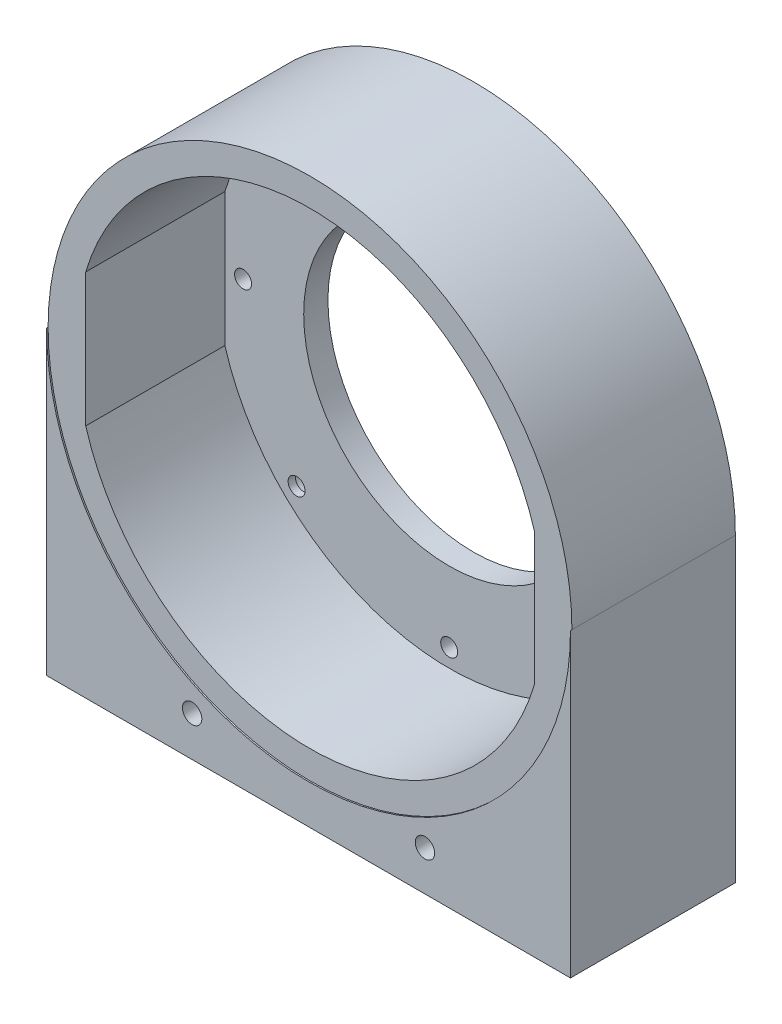
ISO-10303-21;
HEADER;
FILE_DESCRIPTION(('STEP AP214'),'2;1');
FILE_NAME('part.step','',(''),(''),'','','');
FILE_SCHEMA(('AUTOMOTIVE_DESIGN { 1 0 10303 214 1 1 1 1 }'));
ENDSEC;
DATA;
#1=APPLICATION_CONTEXT('core data for automotive mechanical design processes');
#2=APPLICATION_PROTOCOL_DEFINITION('international standard','automotive_design',2000,#1);
#3=PRODUCT_CONTEXT('',#1,'mechanical');
#4=PRODUCT('Part','Part','',(#3));
#5=PRODUCT_RELATED_PRODUCT_CATEGORY('part','',(#4));
#6=PRODUCT_DEFINITION_FORMATION('','',#4);
#7=PRODUCT_DEFINITION_CONTEXT('part definition',#1,'design');
#8=PRODUCT_DEFINITION('design','',#6,#7);
#9=PRODUCT_DEFINITION_SHAPE('','',#8);
#10=(LENGTH_UNIT() NAMED_UNIT(*) SI_UNIT(.MILLI.,.METRE.));
#11=(NAMED_UNIT(*) PLANE_ANGLE_UNIT() SI_UNIT($,.RADIAN.));
#12=(NAMED_UNIT(*) SI_UNIT($,.STERADIAN.) SOLID_ANGLE_UNIT());
#13=UNCERTAINTY_MEASURE_WITH_UNIT(LENGTH_MEASURE(1.E-05),#10,'distance_accuracy_value','');
#14=(GEOMETRIC_REPRESENTATION_CONTEXT(3) GLOBAL_UNCERTAINTY_ASSIGNED_CONTEXT((#13)) GLOBAL_UNIT_ASSIGNED_CONTEXT((#10,
#11,#12)) REPRESENTATION_CONTEXT('',''));
#15=CARTESIAN_POINT('',(0.,0.,0.));
#16=DIRECTION('',(0.,0.,1.));
#17=DIRECTION('',(1.,0.,0.));
#18=AXIS2_PLACEMENT_3D('',#15,#16,#17);
#19=CARTESIAN_POINT('',(0.,0.,28.7));
#20=DIRECTION('',(0.,0.,-1.));
#21=DIRECTION('',(-1.,0.,0.));
#22=AXIS2_PLACEMENT_3D('',#19,#20,#21);
#23=CYLINDRICAL_SURFACE('',#22,54.);
#24=CARTESIAN_POINT('',(0.,0.,-5.));
#25=DIRECTION('',(0.,0.,-1.));
#26=DIRECTION('',(-1.,0.,0.));
#27=AXIS2_PLACEMENT_3D('',#24,#25,#26);
#28=CIRCLE('',#27,54.);
#29=CARTESIAN_POINT('',(-54.,0.,-5.));
#30=VERTEX_POINT('',#29);
#31=CARTESIAN_POINT('',(54.,0.,-5.));
#32=VERTEX_POINT('',#31);
#33=EDGE_CURVE('E42',#30,#32,#28,.T.);
#34=ORIENTED_EDGE('',*,*,#33,.F.);
#35=DIRECTION('',(0.,0.,-1.));
#36=VECTOR('',#35,1.);
#37=CARTESIAN_POINT('',(-54.,0.,29.));
#38=LINE('',#37,#36);
#39=CARTESIAN_POINT('',(-54.,0.,28.7));
#40=VERTEX_POINT('',#39);
#41=EDGE_CURVE('E162',#40,#30,#38,.T.);
#42=ORIENTED_EDGE('',*,*,#41,.F.);
#43=CARTESIAN_POINT('',(0.,0.,28.7));
#44=DIRECTION('',(0.,0.,-1.));
#45=DIRECTION('',(-1.,0.,0.));
#46=AXIS2_PLACEMENT_3D('',#43,#44,#45);
#47=CIRCLE('',#46,54.);
#48=CARTESIAN_POINT('',(54.,0.,28.7));
#49=VERTEX_POINT('',#48);
#50=EDGE_CURVE('E11',#40,#49,#47,.T.);
#51=ORIENTED_EDGE('',*,*,#50,.T.);
#52=DIRECTION('',(0.,0.,-1.));
#53=VECTOR('',#52,1.);
#54=CARTESIAN_POINT('',(54.,0.,29.));
#55=LINE('',#54,#53);
#56=EDGE_CURVE('E158',#49,#32,#55,.T.);
#57=ORIENTED_EDGE('',*,*,#56,.T.);
#58=EDGE_LOOP('',(#34,#42,#51,#57));
#59=FACE_BOUND('',#58,.T.);
#60=ADVANCED_FACE('F39',(#59),#23,.T.);
#61=CARTESIAN_POINT('',(0.,0.,28.7));
#62=DIRECTION('',(0.,0.,-1.));
#63=DIRECTION('',(-1.,0.,0.));
#64=AXIS2_PLACEMENT_3D('',#61,#62,#63);
#65=PLANE('',#64);
#66=DIRECTION('',(0.,1.,0.));
#67=VECTOR('',#66,1.);
#68=CARTESIAN_POINT('',(-46.25,13.7477270848675,28.7));
#69=LINE('',#68,#67);
#70=CARTESIAN_POINT('',(-46.25,-13.7477270848675,28.7));
#71=VERTEX_POINT('',#70);
#72=CARTESIAN_POINT('',(-46.25,13.7477270848675,28.7));
#73=VERTEX_POINT('',#72);
#74=EDGE_CURVE('E134',#71,#73,#69,.T.);
#75=ORIENTED_EDGE('',*,*,#74,.T.);
#76=CARTESIAN_POINT('',(0.,0.,28.7));
#77=DIRECTION('',(0.,0.,-1.));
#78=DIRECTION('',(1.,0.,0.));
#79=AXIS2_PLACEMENT_3D('',#76,#77,#78);
#80=CIRCLE('',#79,48.25);
#81=CARTESIAN_POINT('',(46.25,13.7477270848676,28.7));
#82=VERTEX_POINT('',#81);
#83=EDGE_CURVE('E128',#73,#82,#80,.T.);
#84=ORIENTED_EDGE('',*,*,#83,.T.);
#85=DIRECTION('',(0.,-1.,0.));
#86=VECTOR('',#85,1.);
#87=CARTESIAN_POINT('',(46.25,13.7477270848676,28.7));
#88=LINE('',#87,#86);
#89=CARTESIAN_POINT('',(46.25,-13.7477270848676,28.7));
#90=VERTEX_POINT('',#89);
#91=EDGE_CURVE('E145',#82,#90,#88,.T.);
#92=ORIENTED_EDGE('',*,*,#91,.T.);
#93=CARTESIAN_POINT('',(0.,0.,28.7));
#94=DIRECTION('',(0.,0.,-1.));
#95=DIRECTION('',(-1.,0.,0.));
#96=AXIS2_PLACEMENT_3D('',#93,#94,#95);
#97=CIRCLE('',#96,48.25);
#98=EDGE_CURVE('E142',#90,#71,#97,.T.);
#99=ORIENTED_EDGE('',*,*,#98,.T.);
#100=EDGE_LOOP('',(#75,#84,#92,#99));
#101=FACE_BOUND('',#100,.T.);
#102=ORIENTED_EDGE('',*,*,#50,.F.);
#103=CARTESIAN_POINT('',(0.,0.,28.7));
#104=DIRECTION('',(0.,0.,-1.));
#105=DIRECTION('',(-1.,0.,0.));
#106=AXIS2_PLACEMENT_3D('',#103,#104,#105);
#107=CIRCLE('',#106,54.);
#108=EDGE_CURVE('E150',#40,#49,#107,.F.);
#109=ORIENTED_EDGE('',*,*,#108,.T.);
#110=EDGE_LOOP('',(#102,#109));
#111=FACE_BOUND('',#110,.T.);
#112=ADVANCED_FACE('F282',(#101,#111),#65,.F.);
#113=CARTESIAN_POINT('',(0.,0.,-5.));
#114=DIRECTION('',(0.,0.,-1.));
#115=DIRECTION('',(-1.,0.,0.));
#116=AXIS2_PLACEMENT_3D('',#113,#114,#115);
#117=PLANE('',#116);
#118=CARTESIAN_POINT('',(24.,-53.7837503271966,-5.));
#119=DIRECTION('',(0.,0.,-1.));
#120=DIRECTION('',(-1.,0.,0.));
#121=AXIS2_PLACEMENT_3D('',#118,#119,#120);
#122=CIRCLE('',#121,2.);
#123=CARTESIAN_POINT('',(22.,-53.7837503271966,-5.));
#124=VERTEX_POINT('',#123);
#125=EDGE_CURVE('E263',#124,#124,#122,.T.);
#126=ORIENTED_EDGE('',*,*,#125,.F.);
#127=EDGE_LOOP('',(#126));
#128=FACE_BOUND('',#127,.T.);
#129=CARTESIAN_POINT('',(-24.,-53.7837503271966,-5.));
#130=DIRECTION('',(0.,0.,-1.));
#131=DIRECTION('',(-1.,0.,0.));
#132=AXIS2_PLACEMENT_3D('',#129,#130,#131);
#133=CIRCLE('',#132,2.);
#134=CARTESIAN_POINT('',(-26.,-53.7837503271966,-5.));
#135=VERTEX_POINT('',#134);
#136=EDGE_CURVE('E260',#135,#135,#133,.T.);
#137=ORIENTED_EDGE('',*,*,#136,.F.);
#138=EDGE_LOOP('',(#137));
#139=FACE_BOUND('',#138,.T.);
#140=ORIENTED_EDGE('',*,*,#33,.T.);
#141=DIRECTION('',(0.,-1.,0.));
#142=VECTOR('',#141,1.);
#143=CARTESIAN_POINT('',(54.,0.,-5.));
#144=LINE('',#143,#142);
#145=CARTESIAN_POINT('',(54.,-62.0454729784529,-5.));
#146=VERTEX_POINT('',#145);
#147=EDGE_CURVE('E169',#32,#146,#144,.T.);
#148=ORIENTED_EDGE('',*,*,#147,.T.);
#149=DIRECTION('',(-1.,0.,0.));
#150=VECTOR('',#149,1.);
#151=CARTESIAN_POINT('',(54.,-62.0454729784529,-5.));
#152=LINE('',#151,#150);
#153=CARTESIAN_POINT('',(-54.,-62.0454729784529,-5.));
#154=VERTEX_POINT('',#153);
#155=EDGE_CURVE('E167',#146,#154,#152,.T.);
#156=ORIENTED_EDGE('',*,*,#155,.T.);
#157=DIRECTION('',(0.,1.,0.));
#158=VECTOR('',#157,1.);
#159=CARTESIAN_POINT('',(-54.,-62.0454729784529,-5.));
#160=LINE('',#159,#158);
#161=EDGE_CURVE('E61',#154,#30,#160,.T.);
#162=ORIENTED_EDGE('',*,*,#161,.T.);
#163=EDGE_LOOP('',(#140,#148,#156,#162));
#164=FACE_BOUND('',#163,.T.);
#165=CARTESIAN_POINT('',(-31.466251762801,-31.4662517628017,-5.));
#166=DIRECTION('',(0.,0.,-1.));
#167=DIRECTION('',(-1.,0.,0.));
#168=AXIS2_PLACEMENT_3D('',#165,#166,#167);
#169=CIRCLE('',#168,2.99999999999999);
#170=CARTESIAN_POINT('',(-34.466251762801,-31.4662517628017,-5.));
#171=VERTEX_POINT('',#170);
#172=EDGE_CURVE('E251',#171,#171,#169,.T.);
#173=ORIENTED_EDGE('',*,*,#172,.F.);
#174=EDGE_LOOP('',(#173));
#175=FACE_BOUND('',#174,.T.);
#176=CARTESIAN_POINT('',(42.5,0.,-5.));
#177=DIRECTION('',(0.,0.,-1.));
#178=DIRECTION('',(-1.,0.,0.));
#179=AXIS2_PLACEMENT_3D('',#176,#177,#178);
#180=CIRCLE('',#179,3.);
#181=CARTESIAN_POINT('',(39.5,0.,-5.));
#182=VERTEX_POINT('',#181);
#183=EDGE_CURVE('E186',#182,#182,#180,.T.);
#184=ORIENTED_EDGE('',*,*,#183,.F.);
#185=EDGE_LOOP('',(#184));
#186=FACE_BOUND('',#185,.T.);
#187=CARTESIAN_POINT('',(31.4662517628014,31.4662517628013,-5.));
#188=DIRECTION('',(0.,0.,-1.));
#189=DIRECTION('',(-1.,0.,0.));
#190=AXIS2_PLACEMENT_3D('',#187,#188,#189);
#191=CIRCLE('',#190,3.);
#192=CARTESIAN_POINT('',(28.4662517628014,31.4662517628013,-5.));
#193=VERTEX_POINT('',#192);
#194=EDGE_CURVE('E191',#193,#193,#191,.T.);
#195=ORIENTED_EDGE('',*,*,#194,.F.);
#196=EDGE_LOOP('',(#195));
#197=FACE_BOUND('',#196,.T.);
#198=CARTESIAN_POINT('',(31.4662517628014,-31.4662517628013,-5.));
#199=DIRECTION('',(0.,0.,1.));
#200=DIRECTION('',(1.,0.,0.));
#201=AXIS2_PLACEMENT_3D('',#198,#199,#200);
#202=CIRCLE('',#201,1.75);
#203=CARTESIAN_POINT('',(33.2162517628014,-31.4662517628013,-5.));
#204=VERTEX_POINT('',#203);
#205=EDGE_CURVE('E235',#204,#204,#202,.T.);
#206=ORIENTED_EDGE('',*,*,#205,.T.);
#207=EDGE_LOOP('',(#206));
#208=FACE_BOUND('',#207,.T.);
#209=CARTESIAN_POINT('',(0.,-44.5,-5.));
#210=DIRECTION('',(0.,0.,1.));
#211=DIRECTION('',(1.,0.,0.));
#212=AXIS2_PLACEMENT_3D('',#209,#210,#211);
#213=CIRCLE('',#212,1.75);
#214=CARTESIAN_POINT('',(1.75,-44.5,-5.));
#215=VERTEX_POINT('',#214);
#216=EDGE_CURVE('E229',#215,#215,#213,.T.);
#217=ORIENTED_EDGE('',*,*,#216,.T.);
#218=EDGE_LOOP('',(#217));
#219=FACE_BOUND('',#218,.T.);
#220=CARTESIAN_POINT('',(-31.4662517628014,31.4662517628013,-5.));
#221=DIRECTION('',(0.,0.,1.));
#222=DIRECTION('',(1.,0.,0.));
#223=AXIS2_PLACEMENT_3D('',#220,#221,#222);
#224=CIRCLE('',#223,1.75);
#225=CARTESIAN_POINT('',(-29.7162517628014,31.4662517628013,-5.));
#226=VERTEX_POINT('',#225);
#227=EDGE_CURVE('E220',#226,#226,#224,.T.);
#228=ORIENTED_EDGE('',*,*,#227,.T.);
#229=EDGE_LOOP('',(#228));
#230=FACE_BOUND('',#229,.T.);
#231=CARTESIAN_POINT('',(0.,44.5,-5.));
#232=DIRECTION('',(0.,0.,1.));
#233=DIRECTION('',(1.,0.,0.));
#234=AXIS2_PLACEMENT_3D('',#231,#232,#233);
#235=CIRCLE('',#234,1.75);
#236=CARTESIAN_POINT('',(1.75,44.5,-5.));
#237=VERTEX_POINT('',#236);
#238=EDGE_CURVE('E212',#237,#237,#235,.T.);
#239=ORIENTED_EDGE('',*,*,#238,.T.);
#240=EDGE_LOOP('',(#239));
#241=FACE_BOUND('',#240,.T.);
#242=CARTESIAN_POINT('',(-42.5,0.,-5.));
#243=DIRECTION('',(0.,0.,1.));
#244=DIRECTION('',(1.,0.,0.));
#245=AXIS2_PLACEMENT_3D('',#242,#243,#244);
#246=CIRCLE('',#245,1.75);
#247=CARTESIAN_POINT('',(-40.75,0.,-5.));
#248=VERTEX_POINT('',#247);
#249=EDGE_CURVE('E205',#248,#248,#246,.T.);
#250=ORIENTED_EDGE('',*,*,#249,.T.);
#251=EDGE_LOOP('',(#250));
#252=FACE_BOUND('',#251,.T.);
#253=CARTESIAN_POINT('',(0.,0.,-5.));
#254=DIRECTION('',(0.,0.,1.));
#255=DIRECTION('',(1.,0.,0.));
#256=AXIS2_PLACEMENT_3D('',#253,#254,#255);
#257=CIRCLE('',#256,30.);
#258=CARTESIAN_POINT('',(30.,0.,-5.));
#259=VERTEX_POINT('',#258);
#260=EDGE_CURVE('E199',#259,#259,#257,.T.);
#261=ORIENTED_EDGE('',*,*,#260,.T.);
#262=EDGE_LOOP('',(#261));
#263=FACE_BOUND('',#262,.T.);
#264=ADVANCED_FACE('F279',(#128,#139,#164,#175,#186,#197,#208,#219,#230,#241,#252,#263),#117,.T.);
#265=CARTESIAN_POINT('',(0.,0.,28.7));
#266=DIRECTION('',(0.,0.,-1.));
#267=DIRECTION('',(-1.,0.,0.));
#268=AXIS2_PLACEMENT_3D('',#265,#266,#267);
#269=CYLINDRICAL_SURFACE('',#268,48.25);
#270=DIRECTION('',(0.,0.,-1.));
#271=VECTOR('',#270,1.);
#272=CARTESIAN_POINT('',(-46.25,13.7477270848675,28.7));
#273=LINE('',#272,#271);
#274=CARTESIAN_POINT('',(-46.25,13.7477270848675,0.));
#275=VERTEX_POINT('',#274);
#276=EDGE_CURVE('E122',#73,#275,#273,.T.);
#277=ORIENTED_EDGE('',*,*,#276,.T.);
#278=CARTESIAN_POINT('',(0.,0.,0.));
#279=DIRECTION('',(0.,0.,1.));
#280=DIRECTION('',(1.,0.,0.));
#281=AXIS2_PLACEMENT_3D('',#278,#279,#280);
#282=CIRCLE('',#281,48.25);
#283=CARTESIAN_POINT('',(46.25,13.7477270848676,0.));
#284=VERTEX_POINT('',#283);
#285=EDGE_CURVE('E109',#284,#275,#282,.T.);
#286=ORIENTED_EDGE('',*,*,#285,.F.);
#287=DIRECTION('',(0.,0.,-1.));
#288=VECTOR('',#287,1.);
#289=CARTESIAN_POINT('',(46.25,13.7477270848676,28.7));
#290=LINE('',#289,#288);
#291=EDGE_CURVE('E139',#82,#284,#290,.T.);
#292=ORIENTED_EDGE('',*,*,#291,.F.);
#293=ORIENTED_EDGE('',*,*,#83,.F.);
#294=EDGE_LOOP('',(#277,#286,#292,#293));
#295=FACE_BOUND('',#294,.T.);
#296=ADVANCED_FACE('F126',(#295),#269,.F.);
#297=CARTESIAN_POINT('',(-46.25,13.7477270848675,28.7));
#298=DIRECTION('',(-1.,0.,0.));
#299=DIRECTION('',(0.,0.,1.));
#300=AXIS2_PLACEMENT_3D('',#297,#298,#299);
#301=PLANE('',#300);
#302=DIRECTION('',(0.,0.,-1.));
#303=VECTOR('',#302,1.);
#304=CARTESIAN_POINT('',(-46.25,-13.7477270848675,28.7));
#305=LINE('',#304,#303);
#306=CARTESIAN_POINT('',(-46.25,-13.7477270848675,0.));
#307=VERTEX_POINT('',#306);
#308=EDGE_CURVE('E124',#71,#307,#305,.T.);
#309=ORIENTED_EDGE('',*,*,#308,.T.);
#310=DIRECTION('',(0.,-1.,0.));
#311=VECTOR('',#310,1.);
#312=CARTESIAN_POINT('',(-46.25,0.,0.));
#313=LINE('',#312,#311);
#314=EDGE_CURVE('E112',#275,#307,#313,.T.);
#315=ORIENTED_EDGE('',*,*,#314,.F.);
#316=ORIENTED_EDGE('',*,*,#276,.F.);
#317=ORIENTED_EDGE('',*,*,#74,.F.);
#318=EDGE_LOOP('',(#309,#315,#316,#317));
#319=FACE_BOUND('',#318,.T.);
#320=ADVANCED_FACE('F120',(#319),#301,.F.);
#321=CARTESIAN_POINT('',(0.,0.,28.7));
#322=DIRECTION('',(0.,0.,-1.));
#323=DIRECTION('',(-1.,0.,0.));
#324=AXIS2_PLACEMENT_3D('',#321,#322,#323);
#325=CYLINDRICAL_SURFACE('',#324,48.25);
#326=DIRECTION('',(0.,0.,-1.));
#327=VECTOR('',#326,1.);
#328=CARTESIAN_POINT('',(46.25,-13.7477270848676,28.7));
#329=LINE('',#328,#327);
#330=CARTESIAN_POINT('',(46.25,-13.7477270848676,0.));
#331=VERTEX_POINT('',#330);
#332=EDGE_CURVE('E131',#90,#331,#329,.T.);
#333=ORIENTED_EDGE('',*,*,#332,.T.);
#334=EDGE_CURVE('E53',#307,#331,#282,.T.);
#335=ORIENTED_EDGE('',*,*,#334,.F.);
#336=ORIENTED_EDGE('',*,*,#308,.F.);
#337=ORIENTED_EDGE('',*,*,#98,.F.);
#338=EDGE_LOOP('',(#333,#335,#336,#337));
#339=FACE_BOUND('',#338,.T.);
#340=ADVANCED_FACE('F358',(#339),#325,.F.);
#341=CARTESIAN_POINT('',(46.25,13.7477270848676,28.7));
#342=DIRECTION('',(1.,0.,0.));
#343=DIRECTION('',(0.,0.,-1.));
#344=AXIS2_PLACEMENT_3D('',#341,#342,#343);
#345=PLANE('',#344);
#346=ORIENTED_EDGE('',*,*,#291,.T.);
#347=DIRECTION('',(0.,-1.,0.));
#348=VECTOR('',#347,1.);
#349=CARTESIAN_POINT('',(46.25,0.,0.));
#350=LINE('',#349,#348);
#351=EDGE_CURVE('E113',#284,#331,#350,.T.);
#352=ORIENTED_EDGE('',*,*,#351,.T.);
#353=ORIENTED_EDGE('',*,*,#332,.F.);
#354=ORIENTED_EDGE('',*,*,#91,.F.);
#355=EDGE_LOOP('',(#346,#352,#353,#354));
#356=FACE_BOUND('',#355,.T.);
#357=ADVANCED_FACE('F355',(#356),#345,.F.);
#358=CARTESIAN_POINT('',(0.,0.,29.));
#359=DIRECTION('',(0.,0.,-1.));
#360=DIRECTION('',(-1.,0.,0.));
#361=AXIS2_PLACEMENT_3D('',#358,#359,#360);
#362=CYLINDRICAL_SURFACE('',#361,54.);
#363=ORIENTED_EDGE('',*,*,#108,.F.);
#364=CARTESIAN_POINT('',(-54.,0.,29.));
#365=VERTEX_POINT('',#364);
#366=EDGE_CURVE('E153',#365,#40,#38,.T.);
#367=ORIENTED_EDGE('',*,*,#366,.F.);
#368=CARTESIAN_POINT('',(0.,0.,29.));
#369=DIRECTION('',(0.,0.,1.));
#370=DIRECTION('',(-1.,0.,0.));
#371=AXIS2_PLACEMENT_3D('',#368,#369,#370);
#372=CIRCLE('',#371,54.);
#373=CARTESIAN_POINT('',(54.,0.,29.));
#374=VERTEX_POINT('',#373);
#375=EDGE_CURVE('E166',#365,#374,#372,.T.);
#376=ORIENTED_EDGE('',*,*,#375,.T.);
#377=EDGE_CURVE('E154',#374,#49,#55,.T.);
#378=ORIENTED_EDGE('',*,*,#377,.T.);
#379=EDGE_LOOP('',(#363,#367,#376,#378));
#380=FACE_BOUND('',#379,.T.);
#381=ADVANCED_FACE('F332',(#380),#362,.F.);
#382=CARTESIAN_POINT('',(-54.,-62.0454729784529,29.));
#383=DIRECTION('',(-1.,0.,0.));
#384=DIRECTION('',(0.,0.,1.));
#385=AXIS2_PLACEMENT_3D('',#382,#383,#384);
#386=PLANE('',#385);
#387=ORIENTED_EDGE('',*,*,#161,.F.);
#388=DIRECTION('',(0.,0.,-1.));
#389=VECTOR('',#388,1.);
#390=CARTESIAN_POINT('',(-54.,-62.0454729784529,29.));
#391=LINE('',#390,#389);
#392=CARTESIAN_POINT('',(-54.,-62.0454729784529,29.));
#393=VERTEX_POINT('',#392);
#394=EDGE_CURVE('E160',#393,#154,#391,.T.);
#395=ORIENTED_EDGE('',*,*,#394,.F.);
#396=DIRECTION('',(0.,1.,0.));
#397=VECTOR('',#396,1.);
#398=CARTESIAN_POINT('',(-54.,-62.0454729784529,29.));
#399=LINE('',#398,#397);
#400=EDGE_CURVE('E172',#393,#365,#399,.T.);
#401=ORIENTED_EDGE('',*,*,#400,.T.);
#402=ORIENTED_EDGE('',*,*,#366,.T.);
#403=ORIENTED_EDGE('',*,*,#41,.T.);
#404=EDGE_LOOP('',(#387,#395,#401,#402,#403));
#405=FACE_BOUND('',#404,.T.);
#406=ADVANCED_FACE('F339',(#405),#386,.T.);
#407=CARTESIAN_POINT('',(54.,-62.0454729784529,29.));
#408=DIRECTION('',(0.,-1.,0.));
#409=DIRECTION('',(0.,0.,-1.));
#410=AXIS2_PLACEMENT_3D('',#407,#408,#409);
#411=PLANE('',#410);
#412=ORIENTED_EDGE('',*,*,#155,.F.);
#413=DIRECTION('',(0.,0.,-1.));
#414=VECTOR('',#413,1.);
#415=CARTESIAN_POINT('',(54.,-62.0454729784529,29.));
#416=LINE('',#415,#414);
#417=CARTESIAN_POINT('',(54.,-62.0454729784529,29.));
#418=VERTEX_POINT('',#417);
#419=EDGE_CURVE('E157',#418,#146,#416,.T.);
#420=ORIENTED_EDGE('',*,*,#419,.F.);
#421=DIRECTION('',(-1.,0.,0.));
#422=VECTOR('',#421,1.);
#423=CARTESIAN_POINT('',(54.,-62.0454729784529,29.));
#424=LINE('',#423,#422);
#425=EDGE_CURVE('E175',#418,#393,#424,.T.);
#426=ORIENTED_EDGE('',*,*,#425,.T.);
#427=ORIENTED_EDGE('',*,*,#394,.T.);
#428=EDGE_LOOP('',(#412,#420,#426,#427));
#429=FACE_BOUND('',#428,.T.);
#430=ADVANCED_FACE('F342',(#429),#411,.T.);
#431=CARTESIAN_POINT('',(54.,0.,29.));
#432=DIRECTION('',(1.,0.,0.));
#433=DIRECTION('',(0.,0.,-1.));
#434=AXIS2_PLACEMENT_3D('',#431,#432,#433);
#435=PLANE('',#434);
#436=ORIENTED_EDGE('',*,*,#147,.F.);
#437=ORIENTED_EDGE('',*,*,#56,.F.);
#438=ORIENTED_EDGE('',*,*,#377,.F.);
#439=DIRECTION('',(0.,-1.,0.));
#440=VECTOR('',#439,1.);
#441=CARTESIAN_POINT('',(54.,0.,29.));
#442=LINE('',#441,#440);
#443=EDGE_CURVE('E178',#374,#418,#442,.T.);
#444=ORIENTED_EDGE('',*,*,#443,.T.);
#445=ORIENTED_EDGE('',*,*,#419,.T.);
#446=EDGE_LOOP('',(#436,#437,#438,#444,#445));
#447=FACE_BOUND('',#446,.T.);
#448=ADVANCED_FACE('F329',(#447),#435,.T.);
#449=CARTESIAN_POINT('',(0.,0.,29.));
#450=DIRECTION('',(0.,0.,-1.));
#451=DIRECTION('',(-1.,0.,0.));
#452=AXIS2_PLACEMENT_3D('',#449,#450,#451);
#453=PLANE('',#452);
#454=CARTESIAN_POINT('',(24.,-53.7837503271966,29.));
#455=DIRECTION('',(0.,0.,-1.));
#456=DIRECTION('',(-1.,0.,0.));
#457=AXIS2_PLACEMENT_3D('',#454,#455,#456);
#458=CIRCLE('',#457,2.);
#459=CARTESIAN_POINT('',(22.,-53.7837503271966,29.));
#460=VERTEX_POINT('',#459);
#461=EDGE_CURVE('E254',#460,#460,#458,.T.);
#462=ORIENTED_EDGE('',*,*,#461,.T.);
#463=EDGE_LOOP('',(#462));
#464=FACE_BOUND('',#463,.T.);
#465=CARTESIAN_POINT('',(-24.,-53.7837503271966,29.));
#466=DIRECTION('',(0.,0.,-1.));
#467=DIRECTION('',(-1.,0.,0.));
#468=AXIS2_PLACEMENT_3D('',#465,#466,#467);
#469=CIRCLE('',#468,2.);
#470=CARTESIAN_POINT('',(-26.,-53.7837503271966,29.));
#471=VERTEX_POINT('',#470);
#472=EDGE_CURVE('E257',#471,#471,#469,.T.);
#473=ORIENTED_EDGE('',*,*,#472,.T.);
#474=EDGE_LOOP('',(#473));
#475=FACE_BOUND('',#474,.T.);
#476=ORIENTED_EDGE('',*,*,#375,.F.);
#477=ORIENTED_EDGE('',*,*,#400,.F.);
#478=ORIENTED_EDGE('',*,*,#425,.F.);
#479=ORIENTED_EDGE('',*,*,#443,.F.);
#480=EDGE_LOOP('',(#476,#477,#478,#479));
#481=FACE_BOUND('',#480,.T.);
#482=ADVANCED_FACE('F269',(#464,#475,#481),#453,.F.);
#483=CARTESIAN_POINT('',(-31.466251762801,-31.4662517628017,-10.));
#484=DIRECTION('',(0.,0.,1.));
#485=DIRECTION('',(1.,0.,0.));
#486=AXIS2_PLACEMENT_3D('',#483,#484,#485);
#487=CYLINDRICAL_SURFACE('',#486,1.75);
#488=CARTESIAN_POINT('',(-31.466251762801,-31.4662517628017,0.));
#489=DIRECTION('',(0.,0.,1.));
#490=DIRECTION('',(0.707106781186556,-0.707106781186539,0.));
#491=AXIS2_PLACEMENT_3D('',#488,#489,#490);
#492=CIRCLE('',#491,1.75);
#493=CARTESIAN_POINT('',(-30.2288148957245,-32.7036886298782,0.));
#494=VERTEX_POINT('',#493);
#495=EDGE_CURVE('E196',#494,#494,#492,.T.);
#496=ORIENTED_EDGE('',*,*,#495,.T.);
#497=EDGE_LOOP('',(#496));
#498=FACE_BOUND('',#497,.T.);
#499=CARTESIAN_POINT('',(-31.466251762801,-31.4662517628017,-1.5));
#500=DIRECTION('',(0.,0.,-1.));
#501=DIRECTION('',(-1.,0.,0.));
#502=AXIS2_PLACEMENT_3D('',#499,#500,#501);
#503=CIRCLE('',#502,1.75);
#504=CARTESIAN_POINT('',(-33.216251762801,-31.4662517628017,-1.5));
#505=VERTEX_POINT('',#504);
#506=EDGE_CURVE('E183',#505,#505,#503,.F.);
#507=ORIENTED_EDGE('',*,*,#506,.F.);
#508=EDGE_LOOP('',(#507));
#509=FACE_BOUND('',#508,.T.);
#510=ADVANCED_FACE('F418',(#498,#509),#487,.F.);
#511=CARTESIAN_POINT('',(42.5,0.,-10.));
#512=DIRECTION('',(0.,0.,1.));
#513=DIRECTION('',(1.,0.,0.));
#514=AXIS2_PLACEMENT_3D('',#511,#512,#513);
#515=CYLINDRICAL_SURFACE('',#514,1.75);
#516=CARTESIAN_POINT('',(42.5,0.,0.));
#517=DIRECTION('',(0.,0.,1.));
#518=DIRECTION('',(1.,0.,0.));
#519=AXIS2_PLACEMENT_3D('',#516,#517,#518);
#520=CIRCLE('',#519,1.75);
#521=CARTESIAN_POINT('',(44.25,0.,0.));
#522=VERTEX_POINT('',#521);
#523=EDGE_CURVE('E208',#522,#522,#520,.T.);
#524=ORIENTED_EDGE('',*,*,#523,.T.);
#525=EDGE_LOOP('',(#524));
#526=FACE_BOUND('',#525,.T.);
#527=CARTESIAN_POINT('',(42.5,0.,-1.5));
#528=DIRECTION('',(0.,0.,-1.));
#529=DIRECTION('',(-1.,0.,0.));
#530=AXIS2_PLACEMENT_3D('',#527,#528,#529);
#531=CIRCLE('',#530,1.75);
#532=CARTESIAN_POINT('',(40.75,0.,-1.5));
#533=VERTEX_POINT('',#532);
#534=EDGE_CURVE('E188',#533,#533,#531,.F.);
#535=ORIENTED_EDGE('',*,*,#534,.F.);
#536=EDGE_LOOP('',(#535));
#537=FACE_BOUND('',#536,.T.);
#538=ADVANCED_FACE('F464',(#526,#537),#515,.F.);
#539=CARTESIAN_POINT('',(31.4662517628014,31.4662517628013,-10.));
#540=DIRECTION('',(0.,0.,1.));
#541=DIRECTION('',(1.,0.,0.));
#542=AXIS2_PLACEMENT_3D('',#539,#540,#541);
#543=CYLINDRICAL_SURFACE('',#542,1.75);
#544=CARTESIAN_POINT('',(31.4662517628014,31.4662517628013,0.));
#545=DIRECTION('',(0.,0.,1.));
#546=DIRECTION('',(0.707106781186546,-0.707106781186549,0.));
#547=AXIS2_PLACEMENT_3D('',#544,#545,#546);
#548=CIRCLE('',#547,1.75);
#549=CARTESIAN_POINT('',(32.7036886298779,30.2288148957248,0.));
#550=VERTEX_POINT('',#549);
#551=EDGE_CURVE('E226',#550,#550,#548,.T.);
#552=ORIENTED_EDGE('',*,*,#551,.T.);
#553=EDGE_LOOP('',(#552));
#554=FACE_BOUND('',#553,.T.);
#555=CARTESIAN_POINT('',(31.4662517628014,31.4662517628013,-1.5));
#556=DIRECTION('',(0.,0.,-1.));
#557=DIRECTION('',(-1.,0.,0.));
#558=AXIS2_PLACEMENT_3D('',#555,#556,#557);
#559=CIRCLE('',#558,1.75);
#560=CARTESIAN_POINT('',(29.7162517628014,31.4662517628013,-1.5));
#561=VERTEX_POINT('',#560);
#562=EDGE_CURVE('E193',#561,#561,#559,.F.);
#563=ORIENTED_EDGE('',*,*,#562,.F.);
#564=EDGE_LOOP('',(#563));
#565=FACE_BOUND('',#564,.T.);
#566=ADVANCED_FACE('F316',(#554,#565),#543,.F.);
#567=CARTESIAN_POINT('',(0.,0.,0.));
#568=DIRECTION('',(0.,0.,1.));
#569=DIRECTION('',(1.,0.,0.));
#570=AXIS2_PLACEMENT_3D('',#567,#568,#569);
#571=PLANE('',#570);
#572=ORIENTED_EDGE('',*,*,#495,.F.);
#573=EDGE_LOOP('',(#572));
#574=FACE_BOUND('',#573,.T.);
#575=CARTESIAN_POINT('',(31.4662517628014,-31.4662517628013,0.));
#576=DIRECTION('',(0.,0.,1.));
#577=DIRECTION('',(0.707106781186546,0.707106781186549,0.));
#578=AXIS2_PLACEMENT_3D('',#575,#576,#577);
#579=CIRCLE('',#578,1.75);
#580=CARTESIAN_POINT('',(32.7036886298779,-30.2288148957248,0.));
#581=VERTEX_POINT('',#580);
#582=EDGE_CURVE('E238',#581,#581,#579,.T.);
#583=ORIENTED_EDGE('',*,*,#582,.F.);
#584=EDGE_LOOP('',(#583));
#585=FACE_BOUND('',#584,.T.);
#586=CARTESIAN_POINT('',(0.,-44.5,0.));
#587=DIRECTION('',(0.,0.,1.));
#588=DIRECTION('',(1.,0.,0.));
#589=AXIS2_PLACEMENT_3D('',#586,#587,#588);
#590=CIRCLE('',#589,1.75);
#591=CARTESIAN_POINT('',(1.75,-44.5,0.));
#592=VERTEX_POINT('',#591);
#593=EDGE_CURVE('E232',#592,#592,#590,.T.);
#594=ORIENTED_EDGE('',*,*,#593,.F.);
#595=EDGE_LOOP('',(#594));
#596=FACE_BOUND('',#595,.T.);
#597=ORIENTED_EDGE('',*,*,#551,.F.);
#598=EDGE_LOOP('',(#597));
#599=FACE_BOUND('',#598,.T.);
#600=CARTESIAN_POINT('',(-31.4662517628014,31.4662517628013,0.));
#601=DIRECTION('',(0.,0.,1.));
#602=DIRECTION('',(0.707106781186546,0.707106781186549,0.));
#603=AXIS2_PLACEMENT_3D('',#600,#601,#602);
#604=CIRCLE('',#603,1.75);
#605=CARTESIAN_POINT('',(-30.228814895725,32.7036886298778,0.));
#606=VERTEX_POINT('',#605);
#607=EDGE_CURVE('E223',#606,#606,#604,.T.);
#608=ORIENTED_EDGE('',*,*,#607,.F.);
#609=EDGE_LOOP('',(#608));
#610=FACE_BOUND('',#609,.T.);
#611=CARTESIAN_POINT('',(0.,44.5,0.));
#612=DIRECTION('',(0.,0.,1.));
#613=DIRECTION('',(1.,0.,0.));
#614=AXIS2_PLACEMENT_3D('',#611,#612,#613);
#615=CIRCLE('',#614,1.75);
#616=CARTESIAN_POINT('',(1.75,44.5,0.));
#617=VERTEX_POINT('',#616);
#618=EDGE_CURVE('E217',#617,#617,#615,.T.);
#619=ORIENTED_EDGE('',*,*,#618,.F.);
#620=EDGE_LOOP('',(#619));
#621=FACE_BOUND('',#620,.T.);
#622=ORIENTED_EDGE('',*,*,#523,.F.);
#623=EDGE_LOOP('',(#622));
#624=FACE_BOUND('',#623,.T.);
#625=CARTESIAN_POINT('',(-42.5,0.,0.));
#626=DIRECTION('',(0.,0.,1.));
#627=DIRECTION('',(1.,0.,0.));
#628=AXIS2_PLACEMENT_3D('',#625,#626,#627);
#629=CIRCLE('',#628,1.75);
#630=CARTESIAN_POINT('',(-40.75,0.,0.));
#631=VERTEX_POINT('',#630);
#632=EDGE_CURVE('E209',#631,#631,#629,.T.);
#633=ORIENTED_EDGE('',*,*,#632,.F.);
#634=EDGE_LOOP('',(#633));
#635=FACE_BOUND('',#634,.T.);
#636=CARTESIAN_POINT('',(0.,0.,0.));
#637=DIRECTION('',(0.,0.,1.));
#638=DIRECTION('',(1.,0.,0.));
#639=AXIS2_PLACEMENT_3D('',#636,#637,#638);
#640=CIRCLE('',#639,30.);
#641=CARTESIAN_POINT('',(30.,0.,0.));
#642=VERTEX_POINT('',#641);
#643=EDGE_CURVE('E202',#642,#642,#640,.T.);
#644=ORIENTED_EDGE('',*,*,#643,.F.);
#645=EDGE_LOOP('',(#644));
#646=FACE_BOUND('',#645,.T.);
#647=ORIENTED_EDGE('',*,*,#351,.F.);
#648=ORIENTED_EDGE('',*,*,#285,.T.);
#649=ORIENTED_EDGE('',*,*,#314,.T.);
#650=ORIENTED_EDGE('',*,*,#334,.T.);
#651=EDGE_LOOP('',(#647,#648,#649,#650));
#652=FACE_BOUND('',#651,.T.);
#653=ADVANCED_FACE('F111',(#574,#585,#596,#599,#610,#621,#624,#635,#646,#652),#571,.T.);
#654=CARTESIAN_POINT('',(0.,0.,-8.));
#655=DIRECTION('',(0.,0.,1.));
#656=DIRECTION('',(1.,0.,0.));
#657=AXIS2_PLACEMENT_3D('',#654,#655,#656);
#658=CYLINDRICAL_SURFACE('',#657,30.);
#659=ORIENTED_EDGE('',*,*,#643,.T.);
#660=EDGE_LOOP('',(#659));
#661=FACE_BOUND('',#660,.T.);
#662=ORIENTED_EDGE('',*,*,#260,.F.);
#663=EDGE_LOOP('',(#662));
#664=FACE_BOUND('',#663,.T.);
#665=ADVANCED_FACE('F304',(#661,#664),#658,.F.);
#666=CARTESIAN_POINT('',(-42.5,0.,-10.));
#667=DIRECTION('',(0.,0.,1.));
#668=DIRECTION('',(1.,0.,0.));
#669=AXIS2_PLACEMENT_3D('',#666,#667,#668);
#670=CYLINDRICAL_SURFACE('',#669,1.75);
#671=ORIENTED_EDGE('',*,*,#632,.T.);
#672=EDGE_LOOP('',(#671));
#673=FACE_BOUND('',#672,.T.);
#674=ORIENTED_EDGE('',*,*,#249,.F.);
#675=EDGE_LOOP('',(#674));
#676=FACE_BOUND('',#675,.T.);
#677=ADVANCED_FACE('F306',(#673,#676),#670,.F.);
#678=CARTESIAN_POINT('',(0.,44.5,-10.));
#679=DIRECTION('',(0.,0.,1.));
#680=DIRECTION('',(1.,0.,0.));
#681=AXIS2_PLACEMENT_3D('',#678,#679,#680);
#682=CYLINDRICAL_SURFACE('',#681,1.75);
#683=ORIENTED_EDGE('',*,*,#618,.T.);
#684=EDGE_LOOP('',(#683));
#685=FACE_BOUND('',#684,.T.);
#686=ORIENTED_EDGE('',*,*,#238,.F.);
#687=EDGE_LOOP('',(#686));
#688=FACE_BOUND('',#687,.T.);
#689=ADVANCED_FACE('F313',(#685,#688),#682,.F.);
#690=CARTESIAN_POINT('',(-31.4662517628014,31.4662517628013,-10.));
#691=DIRECTION('',(0.,0.,1.));
#692=DIRECTION('',(1.,0.,0.));
#693=AXIS2_PLACEMENT_3D('',#690,#691,#692);
#694=CYLINDRICAL_SURFACE('',#693,1.75);
#695=ORIENTED_EDGE('',*,*,#607,.T.);
#696=EDGE_LOOP('',(#695));
#697=FACE_BOUND('',#696,.T.);
#698=ORIENTED_EDGE('',*,*,#227,.F.);
#699=EDGE_LOOP('',(#698));
#700=FACE_BOUND('',#699,.T.);
#701=ADVANCED_FACE('F472',(#697,#700),#694,.F.);
#702=CARTESIAN_POINT('',(0.,-44.5,-10.));
#703=DIRECTION('',(0.,0.,1.));
#704=DIRECTION('',(1.,0.,0.));
#705=AXIS2_PLACEMENT_3D('',#702,#703,#704);
#706=CYLINDRICAL_SURFACE('',#705,1.75);
#707=ORIENTED_EDGE('',*,*,#593,.T.);
#708=EDGE_LOOP('',(#707));
#709=FACE_BOUND('',#708,.T.);
#710=ORIENTED_EDGE('',*,*,#216,.F.);
#711=EDGE_LOOP('',(#710));
#712=FACE_BOUND('',#711,.T.);
#713=ADVANCED_FACE('F468',(#709,#712),#706,.F.);
#714=CARTESIAN_POINT('',(31.4662517628014,-31.4662517628013,-10.));
#715=DIRECTION('',(0.,0.,1.));
#716=DIRECTION('',(1.,0.,0.));
#717=AXIS2_PLACEMENT_3D('',#714,#715,#716);
#718=CYLINDRICAL_SURFACE('',#717,1.75);
#719=ORIENTED_EDGE('',*,*,#582,.T.);
#720=EDGE_LOOP('',(#719));
#721=FACE_BOUND('',#720,.T.);
#722=ORIENTED_EDGE('',*,*,#205,.F.);
#723=EDGE_LOOP('',(#722));
#724=FACE_BOUND('',#723,.T.);
#725=ADVANCED_FACE('F458',(#721,#724),#718,.F.);
#726=CARTESIAN_POINT('',(31.4662517628014,31.4662517628013,-1.5));
#727=DIRECTION('',(0.,0.,-1.));
#728=DIRECTION('',(-1.,0.,0.));
#729=AXIS2_PLACEMENT_3D('',#726,#727,#728);
#730=PLANE('',#729);
#731=CARTESIAN_POINT('',(31.4662517628014,31.4662517628013,-1.5));
#732=DIRECTION('',(0.,0.,-1.));
#733=DIRECTION('',(-1.,0.,0.));
#734=AXIS2_PLACEMENT_3D('',#731,#732,#733);
#735=CIRCLE('',#734,3.);
#736=CARTESIAN_POINT('',(28.4662517628014,31.4662517628013,-1.5));
#737=VERTEX_POINT('',#736);
#738=EDGE_CURVE('E197',#737,#737,#735,.T.);
#739=ORIENTED_EDGE('',*,*,#738,.T.);
#740=EDGE_LOOP('',(#739));
#741=FACE_BOUND('',#740,.T.);
#742=ORIENTED_EDGE('',*,*,#562,.T.);
#743=EDGE_LOOP('',(#742));
#744=FACE_BOUND('',#743,.T.);
#745=ADVANCED_FACE('F455',(#741,#744),#730,.T.);
#746=CARTESIAN_POINT('',(31.4662517628014,31.4662517628013,-1.5));
#747=DIRECTION('',(0.,0.,-1.));
#748=DIRECTION('',(-1.,0.,0.));
#749=AXIS2_PLACEMENT_3D('',#746,#747,#748);
#750=CYLINDRICAL_SURFACE('',#749,3.);
#751=ORIENTED_EDGE('',*,*,#738,.F.);
#752=EDGE_LOOP('',(#751));
#753=FACE_BOUND('',#752,.T.);
#754=ORIENTED_EDGE('',*,*,#194,.T.);
#755=EDGE_LOOP('',(#754));
#756=FACE_BOUND('',#755,.T.);
#757=ADVANCED_FACE('F450',(#753,#756),#750,.F.);
#758=CARTESIAN_POINT('',(42.5,0.,-1.5));
#759=DIRECTION('',(0.,0.,-1.));
#760=DIRECTION('',(-1.,0.,0.));
#761=AXIS2_PLACEMENT_3D('',#758,#759,#760);
#762=PLANE('',#761);
#763=CARTESIAN_POINT('',(42.5,0.,-1.5));
#764=DIRECTION('',(0.,0.,-1.));
#765=DIRECTION('',(-1.,0.,0.));
#766=AXIS2_PLACEMENT_3D('',#763,#764,#765);
#767=CIRCLE('',#766,3.);
#768=CARTESIAN_POINT('',(39.5,0.,-1.5));
#769=VERTEX_POINT('',#768);
#770=EDGE_CURVE('E192',#769,#769,#767,.T.);
#771=ORIENTED_EDGE('',*,*,#770,.T.);
#772=EDGE_LOOP('',(#771));
#773=FACE_BOUND('',#772,.T.);
#774=ORIENTED_EDGE('',*,*,#534,.T.);
#775=EDGE_LOOP('',(#774));
#776=FACE_BOUND('',#775,.T.);
#777=ADVANCED_FACE('F447',(#773,#776),#762,.T.);
#778=CARTESIAN_POINT('',(42.5,0.,-1.5));
#779=DIRECTION('',(0.,0.,-1.));
#780=DIRECTION('',(-1.,0.,0.));
#781=AXIS2_PLACEMENT_3D('',#778,#779,#780);
#782=CYLINDRICAL_SURFACE('',#781,3.);
#783=ORIENTED_EDGE('',*,*,#770,.F.);
#784=EDGE_LOOP('',(#783));
#785=FACE_BOUND('',#784,.T.);
#786=ORIENTED_EDGE('',*,*,#183,.T.);
#787=EDGE_LOOP('',(#786));
#788=FACE_BOUND('',#787,.T.);
#789=ADVANCED_FACE('F444',(#785,#788),#782,.F.);
#790=CARTESIAN_POINT('',(-31.466251762801,-31.4662517628017,-1.5));
#791=DIRECTION('',(0.,0.,-1.));
#792=DIRECTION('',(-1.,0.,0.));
#793=AXIS2_PLACEMENT_3D('',#790,#791,#792);
#794=PLANE('',#793);
#795=CARTESIAN_POINT('',(-31.466251762801,-31.4662517628017,-1.5));
#796=DIRECTION('',(0.,0.,-1.));
#797=DIRECTION('',(-1.,0.,0.));
#798=AXIS2_PLACEMENT_3D('',#795,#796,#797);
#799=CIRCLE('',#798,2.99999999999999);
#800=CARTESIAN_POINT('',(-34.466251762801,-31.4662517628017,-1.5));
#801=VERTEX_POINT('',#800);
#802=EDGE_CURVE('E187',#801,#801,#799,.T.);
#803=ORIENTED_EDGE('',*,*,#802,.T.);
#804=EDGE_LOOP('',(#803));
#805=FACE_BOUND('',#804,.T.);
#806=ORIENTED_EDGE('',*,*,#506,.T.);
#807=EDGE_LOOP('',(#806));
#808=FACE_BOUND('',#807,.T.);
#809=ADVANCED_FACE('F437',(#805,#808),#794,.T.);
#810=CARTESIAN_POINT('',(-31.466251762801,-31.4662517628017,-1.5));
#811=DIRECTION('',(0.,0.,-1.));
#812=DIRECTION('',(-1.,0.,0.));
#813=AXIS2_PLACEMENT_3D('',#810,#811,#812);
#814=CYLINDRICAL_SURFACE('',#813,2.99999999999999);
#815=ORIENTED_EDGE('',*,*,#802,.F.);
#816=EDGE_LOOP('',(#815));
#817=FACE_BOUND('',#816,.T.);
#818=ORIENTED_EDGE('',*,*,#172,.T.);
#819=EDGE_LOOP('',(#818));
#820=FACE_BOUND('',#819,.T.);
#821=ADVANCED_FACE('F426',(#817,#820),#814,.F.);
#822=CARTESIAN_POINT('',(-24.,-53.7837503271966,29.));
#823=DIRECTION('',(0.,0.,-1.));
#824=DIRECTION('',(-1.,0.,0.));
#825=AXIS2_PLACEMENT_3D('',#822,#823,#824);
#826=CYLINDRICAL_SURFACE('',#825,2.);
#827=ORIENTED_EDGE('',*,*,#472,.F.);
#828=EDGE_LOOP('',(#827));
#829=FACE_BOUND('',#828,.T.);
#830=ORIENTED_EDGE('',*,*,#136,.T.);
#831=EDGE_LOOP('',(#830));
#832=FACE_BOUND('',#831,.T.);
#833=ADVANCED_FACE('F275',(#829,#832),#826,.F.);
#834=CARTESIAN_POINT('',(24.,-53.7837503271966,29.));
#835=DIRECTION('',(0.,0.,-1.));
#836=DIRECTION('',(-1.,0.,0.));
#837=AXIS2_PLACEMENT_3D('',#834,#835,#836);
#838=CYLINDRICAL_SURFACE('',#837,2.);
#839=ORIENTED_EDGE('',*,*,#461,.F.);
#840=EDGE_LOOP('',(#839));
#841=FACE_BOUND('',#840,.T.);
#842=ORIENTED_EDGE('',*,*,#125,.T.);
#843=EDGE_LOOP('',(#842));
#844=FACE_BOUND('',#843,.T.);
#845=ADVANCED_FACE('F272',(#841,#844),#838,.F.);
#846=CLOSED_SHELL('',(#60,#112,#264,#296,#320,#340,#357,#381,#406,#430,#448,#482,#510,#538,#566,
#653,#665,#677,#689,#701,#713,#725,#745,#757,#777,#789,#809,#821,#833,#845));
#847=MANIFOLD_SOLID_BREP('B2',#846);
#848=ADVANCED_BREP_SHAPE_REPRESENTATION('',(#18,#847),#14);
#849=SHAPE_DEFINITION_REPRESENTATION(#9,#848);
ENDSEC;
END-ISO-10303-21;
